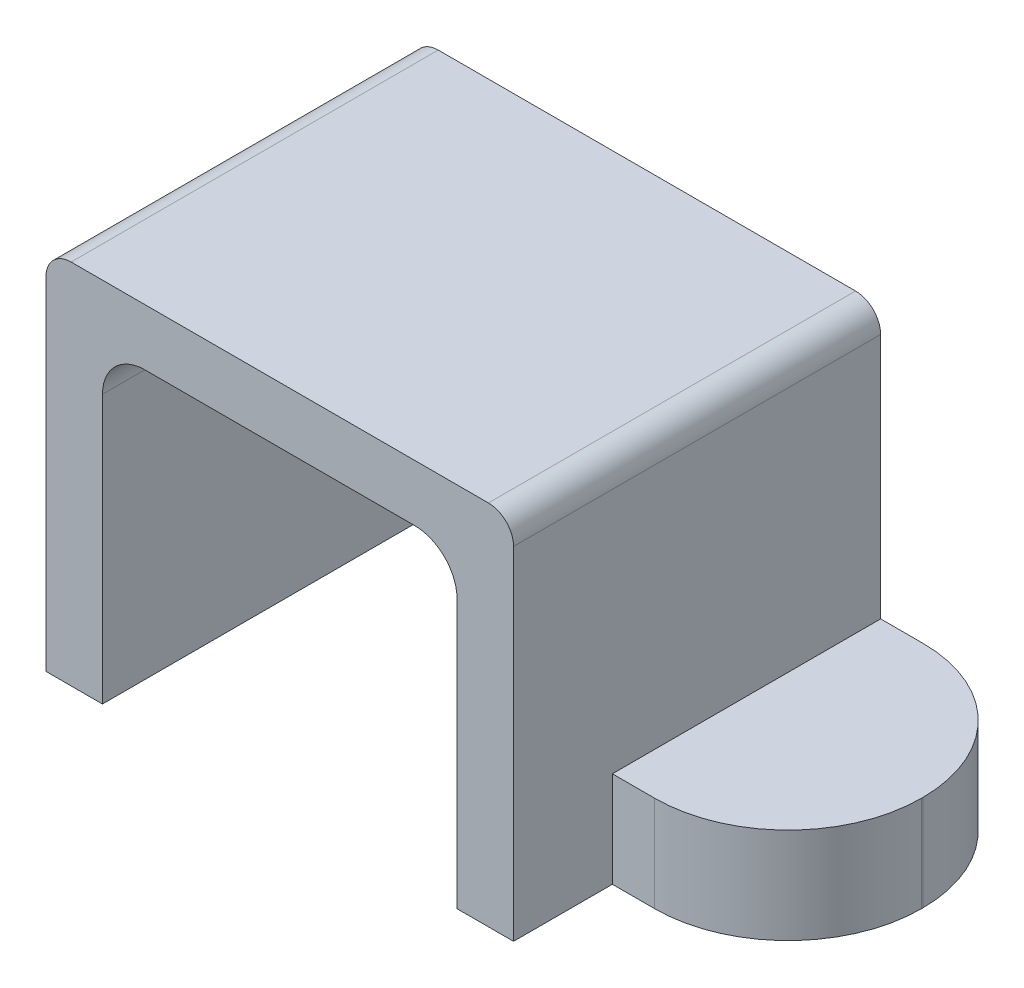
ISO-10303-21;
HEADER;
FILE_DESCRIPTION(('STEP AP214'),'2;1');
FILE_NAME('part.step','',(''),(''),'','','');
FILE_SCHEMA(('AUTOMOTIVE_DESIGN { 1 0 10303 214 1 1 1 1 }'));
ENDSEC;
DATA;
#1=APPLICATION_CONTEXT('core data for automotive mechanical design processes');
#2=APPLICATION_PROTOCOL_DEFINITION('international standard','automotive_design',2000,#1);
#3=PRODUCT_CONTEXT('',#1,'mechanical');
#4=PRODUCT('Part','Part','',(#3));
#5=PRODUCT_RELATED_PRODUCT_CATEGORY('part','',(#4));
#6=PRODUCT_DEFINITION_FORMATION('','',#4);
#7=PRODUCT_DEFINITION_CONTEXT('part definition',#1,'design');
#8=PRODUCT_DEFINITION('design','',#6,#7);
#9=PRODUCT_DEFINITION_SHAPE('','',#8);
#10=(LENGTH_UNIT() NAMED_UNIT(*) SI_UNIT(.MILLI.,.METRE.));
#11=(NAMED_UNIT(*) PLANE_ANGLE_UNIT() SI_UNIT($,.RADIAN.));
#12=(NAMED_UNIT(*) SI_UNIT($,.STERADIAN.) SOLID_ANGLE_UNIT());
#13=UNCERTAINTY_MEASURE_WITH_UNIT(LENGTH_MEASURE(1.E-05),#10,'distance_accuracy_value','');
#14=(GEOMETRIC_REPRESENTATION_CONTEXT(3) GLOBAL_UNCERTAINTY_ASSIGNED_CONTEXT((#13)) GLOBAL_UNIT_ASSIGNED_CONTEXT((#10,
#11,#12)) REPRESENTATION_CONTEXT('',''));
#15=CARTESIAN_POINT('',(0.,0.,0.));
#16=DIRECTION('',(0.,0.,1.));
#17=DIRECTION('',(1.,0.,0.));
#18=AXIS2_PLACEMENT_3D('',#15,#16,#17);
#19=CARTESIAN_POINT('',(7.45,-5.85,11.7));
#20=DIRECTION('',(-1.,0.,0.));
#21=DIRECTION('',(0.,0.,1.));
#22=AXIS2_PLACEMENT_3D('',#19,#20,#21);
#23=PLANE('',#22);
#24=DIRECTION('',(0.,0.,1.));
#25=VECTOR('',#24,1.);
#26=CARTESIAN_POINT('',(7.45,-2.8,0.));
#27=LINE('',#26,#25);
#28=CARTESIAN_POINT('',(7.45,-2.8,0.));
#29=VERTEX_POINT('',#28);
#30=CARTESIAN_POINT('',(7.45,-2.8,8.55));
#31=VERTEX_POINT('',#30);
#32=EDGE_CURVE('E202',#29,#31,#27,.T.);
#33=ORIENTED_EDGE('',*,*,#32,.F.);
#34=DIRECTION('',(0.,1.,0.));
#35=VECTOR('',#34,1.);
#36=CARTESIAN_POINT('',(7.45,-5.85,0.));
#37=LINE('',#36,#35);
#38=CARTESIAN_POINT('',(7.45,5.05,0.));
#39=VERTEX_POINT('',#38);
#40=EDGE_CURVE('E208',#29,#39,#37,.T.);
#41=ORIENTED_EDGE('',*,*,#40,.T.);
#42=DIRECTION('',(0.,0.,-1.));
#43=VECTOR('',#42,1.);
#44=CARTESIAN_POINT('',(7.45,5.05,11.7));
#45=LINE('',#44,#43);
#46=CARTESIAN_POINT('',(7.45,5.05,11.7));
#47=VERTEX_POINT('',#46);
#48=EDGE_CURVE('E340',#39,#47,#45,.F.);
#49=ORIENTED_EDGE('',*,*,#48,.T.);
#50=DIRECTION('',(0.,1.,0.));
#51=VECTOR('',#50,1.);
#52=CARTESIAN_POINT('',(7.45,-5.85,11.7));
#53=LINE('',#52,#51);
#54=CARTESIAN_POINT('',(7.45,-5.85,11.7));
#55=VERTEX_POINT('',#54);
#56=EDGE_CURVE('E300',#55,#47,#53,.T.);
#57=ORIENTED_EDGE('',*,*,#56,.F.);
#58=DIRECTION('',(0.,0.,-1.));
#59=VECTOR('',#58,1.);
#60=CARTESIAN_POINT('',(7.45,-5.85,11.7));
#61=LINE('',#60,#59);
#62=CARTESIAN_POINT('',(7.45,-5.85,8.55));
#63=VERTEX_POINT('',#62);
#64=EDGE_CURVE('E312',#55,#63,#61,.T.);
#65=ORIENTED_EDGE('',*,*,#64,.T.);
#66=DIRECTION('',(0.,1.,0.));
#67=VECTOR('',#66,1.);
#68=CARTESIAN_POINT('',(7.45,-5.85,8.55));
#69=LINE('',#68,#67);
#70=EDGE_CURVE('E220',#63,#31,#69,.T.);
#71=ORIENTED_EDGE('',*,*,#70,.T.);
#72=EDGE_LOOP('',(#33,#41,#49,#57,#65,#71));
#73=FACE_BOUND('',#72,.T.);
#74=ADVANCED_FACE('F33',(#73),#23,.F.);
#75=CARTESIAN_POINT('',(-7.45,-5.85,11.7));
#76=DIRECTION('',(1.,0.,0.));
#77=DIRECTION('',(0.,0.,-1.));
#78=AXIS2_PLACEMENT_3D('',#75,#76,#77);
#79=PLANE('',#78);
#80=DIRECTION('',(0.,1.,0.));
#81=VECTOR('',#80,1.);
#82=CARTESIAN_POINT('',(-7.45,-5.85,8.55));
#83=LINE('',#82,#81);
#84=CARTESIAN_POINT('',(-7.45,-5.85,8.55));
#85=VERTEX_POINT('',#84);
#86=CARTESIAN_POINT('',(-7.45,-2.8,8.55));
#87=VERTEX_POINT('',#86);
#88=EDGE_CURVE('E204',#85,#87,#83,.T.);
#89=ORIENTED_EDGE('',*,*,#88,.F.);
#90=DIRECTION('',(0.,0.,-1.));
#91=VECTOR('',#90,1.);
#92=CARTESIAN_POINT('',(-7.45,-5.85,11.7));
#93=LINE('',#92,#91);
#94=CARTESIAN_POINT('',(-7.45,-5.85,11.7));
#95=VERTEX_POINT('',#94);
#96=EDGE_CURVE('E322',#95,#85,#93,.T.);
#97=ORIENTED_EDGE('',*,*,#96,.F.);
#98=DIRECTION('',(0.,-1.,0.));
#99=VECTOR('',#98,1.);
#100=CARTESIAN_POINT('',(-7.45,-5.85,11.7));
#101=LINE('',#100,#99);
#102=CARTESIAN_POINT('',(-7.45,5.05,11.7));
#103=VERTEX_POINT('',#102);
#104=EDGE_CURVE('E307',#103,#95,#101,.T.);
#105=ORIENTED_EDGE('',*,*,#104,.F.);
#106=DIRECTION('',(0.,0.,-1.));
#107=VECTOR('',#106,1.);
#108=CARTESIAN_POINT('',(-7.45,5.05,11.7));
#109=LINE('',#108,#107);
#110=CARTESIAN_POINT('',(-7.45,5.05,0.));
#111=VERTEX_POINT('',#110);
#112=EDGE_CURVE('E325',#103,#111,#109,.T.);
#113=ORIENTED_EDGE('',*,*,#112,.T.);
#114=DIRECTION('',(0.,-1.,0.));
#115=VECTOR('',#114,1.);
#116=CARTESIAN_POINT('',(-7.45,-5.85,0.));
#117=LINE('',#116,#115);
#118=CARTESIAN_POINT('',(-7.45,-2.8,0.));
#119=VERTEX_POINT('',#118);
#120=EDGE_CURVE('E316',#111,#119,#117,.T.);
#121=ORIENTED_EDGE('',*,*,#120,.T.);
#122=DIRECTION('',(0.,0.,-1.));
#123=VECTOR('',#122,1.);
#124=CARTESIAN_POINT('',(-7.45,-2.8,0.));
#125=LINE('',#124,#123);
#126=EDGE_CURVE('E235',#87,#119,#125,.T.);
#127=ORIENTED_EDGE('',*,*,#126,.F.);
#128=EDGE_LOOP('',(#89,#97,#105,#113,#121,#127));
#129=FACE_BOUND('',#128,.T.);
#130=ADVANCED_FACE('F389',(#129),#79,.F.);
#131=CARTESIAN_POINT('',(-7.45,-5.85,11.7));
#132=DIRECTION('',(0.,1.,0.));
#133=DIRECTION('',(0.,0.,1.));
#134=AXIS2_PLACEMENT_3D('',#131,#132,#133);
#135=PLANE('',#134);
#136=DIRECTION('',(1.,0.,0.));
#137=VECTOR('',#136,1.);
#138=CARTESIAN_POINT('',(-7.45,-5.85,0.));
#139=LINE('',#138,#137);
#140=CARTESIAN_POINT('',(5.65,-5.85,0.));
#141=VERTEX_POINT('',#140);
#142=CARTESIAN_POINT('',(8.8,-5.85,0.));
#143=VERTEX_POINT('',#142);
#144=EDGE_CURVE('E319',#141,#143,#139,.T.);
#145=ORIENTED_EDGE('',*,*,#144,.T.);
#146=CARTESIAN_POINT('',(8.8,-5.85,4.25));
#147=DIRECTION('',(0.,1.,0.));
#148=DIRECTION('',(0.,0.,1.));
#149=AXIS2_PLACEMENT_3D('',#146,#147,#148);
#150=CIRCLE('',#149,4.25);
#151=CARTESIAN_POINT('',(13.05,-5.85,4.25));
#152=VERTEX_POINT('',#151);
#153=EDGE_CURVE('E41',#143,#152,#150,.F.);
#154=ORIENTED_EDGE('',*,*,#153,.T.);
#155=DIRECTION('',(0.,0.,1.));
#156=VECTOR('',#155,1.);
#157=CARTESIAN_POINT('',(13.05,-5.85,0.));
#158=LINE('',#157,#156);
#159=CARTESIAN_POINT('',(13.05,-5.85,4.3));
#160=VERTEX_POINT('',#159);
#161=EDGE_CURVE('E225',#152,#160,#158,.T.);
#162=ORIENTED_EDGE('',*,*,#161,.T.);
#163=CARTESIAN_POINT('',(8.8,-5.85,4.3));
#164=DIRECTION('',(0.,1.,0.));
#165=DIRECTION('',(0.,0.,1.));
#166=AXIS2_PLACEMENT_3D('',#163,#164,#165);
#167=CIRCLE('',#166,4.25);
#168=CARTESIAN_POINT('',(8.8,-5.85,8.55));
#169=VERTEX_POINT('',#168);
#170=EDGE_CURVE('E48',#160,#169,#167,.F.);
#171=ORIENTED_EDGE('',*,*,#170,.T.);
#172=DIRECTION('',(-1.,0.,0.));
#173=VECTOR('',#172,1.);
#174=CARTESIAN_POINT('',(13.05,-5.85,8.55));
#175=LINE('',#174,#173);
#176=EDGE_CURVE('E228',#169,#63,#175,.T.);
#177=ORIENTED_EDGE('',*,*,#176,.T.);
#178=ORIENTED_EDGE('',*,*,#64,.F.);
#179=DIRECTION('',(1.,0.,0.));
#180=VECTOR('',#179,1.);
#181=CARTESIAN_POINT('',(-7.45,-5.85,11.7));
#182=LINE('',#181,#180);
#183=CARTESIAN_POINT('',(5.65,-5.85,11.7));
#184=VERTEX_POINT('',#183);
#185=EDGE_CURVE('E309',#184,#55,#182,.T.);
#186=ORIENTED_EDGE('',*,*,#185,.F.);
#187=DIRECTION('',(0.,0.,1.));
#188=VECTOR('',#187,1.);
#189=CARTESIAN_POINT('',(5.65,-5.85,9.4));
#190=LINE('',#189,#188);
#191=EDGE_CURVE('E296',#141,#184,#190,.T.);
#192=ORIENTED_EDGE('',*,*,#191,.F.);
#193=EDGE_LOOP('',(#145,#154,#162,#171,#177,#178,#186,#192));
#194=FACE_BOUND('',#193,.T.);
#195=ADVANCED_FACE('F371',(#194),#135,.F.);
#196=CARTESIAN_POINT('',(-7.45,5.85,11.7));
#197=DIRECTION('',(0.,-1.,0.));
#198=DIRECTION('',(0.,0.,-1.));
#199=AXIS2_PLACEMENT_3D('',#196,#197,#198);
#200=PLANE('',#199);
#201=DIRECTION('',(-1.,0.,0.));
#202=VECTOR('',#201,1.);
#203=CARTESIAN_POINT('',(-7.45,5.85,0.));
#204=LINE('',#203,#202);
#205=CARTESIAN_POINT('',(6.65,5.85,0.));
#206=VERTEX_POINT('',#205);
#207=CARTESIAN_POINT('',(-6.65,5.85,0.));
#208=VERTEX_POINT('',#207);
#209=EDGE_CURVE('E214',#206,#208,#204,.T.);
#210=ORIENTED_EDGE('',*,*,#209,.T.);
#211=DIRECTION('',(0.,0.,-1.));
#212=VECTOR('',#211,1.);
#213=CARTESIAN_POINT('',(-6.65,5.85,11.7));
#214=LINE('',#213,#212);
#215=CARTESIAN_POINT('',(-6.65,5.85,11.7));
#216=VERTEX_POINT('',#215);
#217=EDGE_CURVE('E334',#208,#216,#214,.F.);
#218=ORIENTED_EDGE('',*,*,#217,.T.);
#219=DIRECTION('',(-1.,0.,0.));
#220=VECTOR('',#219,1.);
#221=CARTESIAN_POINT('',(-7.45,5.85,11.7));
#222=LINE('',#221,#220);
#223=CARTESIAN_POINT('',(6.65,5.85,11.7));
#224=VERTEX_POINT('',#223);
#225=EDGE_CURVE('E303',#224,#216,#222,.T.);
#226=ORIENTED_EDGE('',*,*,#225,.F.);
#227=DIRECTION('',(0.,0.,-1.));
#228=VECTOR('',#227,1.);
#229=CARTESIAN_POINT('',(6.65,5.85,11.7));
#230=LINE('',#229,#228);
#231=EDGE_CURVE('E331',#224,#206,#230,.T.);
#232=ORIENTED_EDGE('',*,*,#231,.T.);
#233=EDGE_LOOP('',(#210,#218,#226,#232));
#234=FACE_BOUND('',#233,.T.);
#235=ADVANCED_FACE('F398',(#234),#200,.F.);
#236=DIRECTION('',(1.,0.,0.));
#237=VECTOR('',#236,1.);
#238=CARTESIAN_POINT('',(-13.05,-5.85,8.55));
#239=LINE('',#238,#237);
#240=CARTESIAN_POINT('',(-8.8,-5.85,8.55));
#241=VERTEX_POINT('',#240);
#242=EDGE_CURVE('E246',#241,#85,#239,.T.);
#243=ORIENTED_EDGE('',*,*,#242,.F.);
#244=CARTESIAN_POINT('',(-8.8,-5.85,4.3));
#245=DIRECTION('',(0.,1.,0.));
#246=DIRECTION('',(0.,0.,1.));
#247=AXIS2_PLACEMENT_3D('',#244,#245,#246);
#248=CIRCLE('',#247,4.25);
#249=CARTESIAN_POINT('',(-13.05,-5.85,4.3));
#250=VERTEX_POINT('',#249);
#251=EDGE_CURVE('E356',#241,#250,#248,.F.);
#252=ORIENTED_EDGE('',*,*,#251,.T.);
#253=DIRECTION('',(0.,0.,1.));
#254=VECTOR('',#253,1.);
#255=CARTESIAN_POINT('',(-13.05,-5.85,0.));
#256=LINE('',#255,#254);
#257=CARTESIAN_POINT('',(-13.05,-5.85,4.25));
#258=VERTEX_POINT('',#257);
#259=EDGE_CURVE('E231',#258,#250,#256,.T.);
#260=ORIENTED_EDGE('',*,*,#259,.F.);
#261=CARTESIAN_POINT('',(-8.8,-5.85,4.25));
#262=DIRECTION('',(0.,1.,0.));
#263=DIRECTION('',(0.,0.,1.));
#264=AXIS2_PLACEMENT_3D('',#261,#262,#263);
#265=CIRCLE('',#264,4.25);
#266=CARTESIAN_POINT('',(-8.8,-5.85,0.));
#267=VERTEX_POINT('',#266);
#268=EDGE_CURVE('E354',#258,#267,#265,.F.);
#269=ORIENTED_EDGE('',*,*,#268,.T.);
#270=CARTESIAN_POINT('',(-5.65,-5.85,0.));
#271=VERTEX_POINT('',#270);
#272=EDGE_CURVE('E304',#267,#271,#139,.T.);
#273=ORIENTED_EDGE('',*,*,#272,.T.);
#274=DIRECTION('',(0.,0.,1.));
#275=VECTOR('',#274,1.);
#276=CARTESIAN_POINT('',(-5.65,-5.85,9.4));
#277=LINE('',#276,#275);
#278=CARTESIAN_POINT('',(-5.65,-5.85,11.7));
#279=VERTEX_POINT('',#278);
#280=EDGE_CURVE('E276',#271,#279,#277,.T.);
#281=ORIENTED_EDGE('',*,*,#280,.T.);
#282=EDGE_CURVE('E310',#95,#279,#182,.T.);
#283=ORIENTED_EDGE('',*,*,#282,.F.);
#284=ORIENTED_EDGE('',*,*,#96,.T.);
#285=EDGE_LOOP('',(#243,#252,#260,#269,#273,#281,#283,#284));
#286=FACE_BOUND('',#285,.T.);
#287=ADVANCED_FACE('F441',(#286),#135,.F.);
#288=CARTESIAN_POINT('',(0.,0.,11.7));
#289=DIRECTION('',(0.,0.,-1.));
#290=DIRECTION('',(-1.,0.,0.));
#291=AXIS2_PLACEMENT_3D('',#288,#289,#290);
#292=PLANE('',#291);
#293=ORIENTED_EDGE('',*,*,#225,.T.);
#294=CARTESIAN_POINT('',(-6.65,5.05,11.7));
#295=DIRECTION('',(0.,0.,-1.));
#296=DIRECTION('',(-1.,0.,0.));
#297=AXIS2_PLACEMENT_3D('',#294,#295,#296);
#298=CIRCLE('',#297,0.8);
#299=EDGE_CURVE('E338',#216,#103,#298,.F.);
#300=ORIENTED_EDGE('',*,*,#299,.T.);
#301=ORIENTED_EDGE('',*,*,#104,.T.);
#302=ORIENTED_EDGE('',*,*,#282,.T.);
#303=DIRECTION('',(0.,-1.,0.));
#304=VECTOR('',#303,1.);
#305=CARTESIAN_POINT('',(-5.65,-5.85,11.7));
#306=LINE('',#305,#304);
#307=CARTESIAN_POINT('',(-5.65,2.7,11.7));
#308=VERTEX_POINT('',#307);
#309=EDGE_CURVE('E269',#308,#279,#306,.T.);
#310=ORIENTED_EDGE('',*,*,#309,.F.);
#311=CARTESIAN_POINT('',(-4.3,2.7,11.7));
#312=DIRECTION('',(0.,0.,1.));
#313=DIRECTION('',(-1.,0.,0.));
#314=AXIS2_PLACEMENT_3D('',#311,#312,#313);
#315=CIRCLE('',#314,1.35);
#316=CARTESIAN_POINT('',(-4.3,4.05,11.7));
#317=VERTEX_POINT('',#316);
#318=EDGE_CURVE('E273',#317,#308,#315,.T.);
#319=ORIENTED_EDGE('',*,*,#318,.F.);
#320=DIRECTION('',(-1.,0.,0.));
#321=VECTOR('',#320,1.);
#322=CARTESIAN_POINT('',(-4.3,4.05,11.7));
#323=LINE('',#322,#321);
#324=CARTESIAN_POINT('',(4.3,4.05,11.7));
#325=VERTEX_POINT('',#324);
#326=EDGE_CURVE('E284',#325,#317,#323,.T.);
#327=ORIENTED_EDGE('',*,*,#326,.F.);
#328=CARTESIAN_POINT('',(4.3,2.7,11.7));
#329=DIRECTION('',(0.,0.,1.));
#330=DIRECTION('',(-1.,0.,0.));
#331=AXIS2_PLACEMENT_3D('',#328,#329,#330);
#332=CIRCLE('',#331,1.35);
#333=CARTESIAN_POINT('',(5.65,2.7,11.7));
#334=VERTEX_POINT('',#333);
#335=EDGE_CURVE('E281',#334,#325,#332,.T.);
#336=ORIENTED_EDGE('',*,*,#335,.F.);
#337=DIRECTION('',(0.,1.,0.));
#338=VECTOR('',#337,1.);
#339=CARTESIAN_POINT('',(5.65,-5.85,11.7));
#340=LINE('',#339,#338);
#341=EDGE_CURVE('E278',#184,#334,#340,.T.);
#342=ORIENTED_EDGE('',*,*,#341,.F.);
#343=ORIENTED_EDGE('',*,*,#185,.T.);
#344=ORIENTED_EDGE('',*,*,#56,.T.);
#345=CARTESIAN_POINT('',(6.65,5.05,11.7));
#346=DIRECTION('',(0.,0.,-1.));
#347=DIRECTION('',(-1.,0.,0.));
#348=AXIS2_PLACEMENT_3D('',#345,#346,#347);
#349=CIRCLE('',#348,0.8);
#350=EDGE_CURVE('E336',#47,#224,#349,.F.);
#351=ORIENTED_EDGE('',*,*,#350,.T.);
#352=EDGE_LOOP('',(#293,#300,#301,#302,#310,#319,#327,#336,#342,#343,#344,#351));
#353=FACE_BOUND('',#352,.T.);
#354=ADVANCED_FACE('F445',(#353),#292,.F.);
#355=CARTESIAN_POINT('',(0.,0.,0.));
#356=DIRECTION('',(0.,0.,-1.));
#357=DIRECTION('',(-1.,0.,0.));
#358=AXIS2_PLACEMENT_3D('',#355,#356,#357);
#359=PLANE('',#358);
#360=DIRECTION('',(-1.,0.,0.));
#361=VECTOR('',#360,1.);
#362=CARTESIAN_POINT('',(13.05,-2.8,0.));
#363=LINE('',#362,#361);
#364=CARTESIAN_POINT('',(8.8,-2.8,0.));
#365=VERTEX_POINT('',#364);
#366=EDGE_CURVE('E196',#365,#29,#363,.T.);
#367=ORIENTED_EDGE('',*,*,#366,.F.);
#368=DIRECTION('',(0.,1.,0.));
#369=VECTOR('',#368,1.);
#370=CARTESIAN_POINT('',(8.8,0.,0.));
#371=LINE('',#370,#369);
#372=EDGE_CURVE('E56',#365,#143,#371,.F.);
#373=ORIENTED_EDGE('',*,*,#372,.T.);
#374=ORIENTED_EDGE('',*,*,#144,.F.);
#375=DIRECTION('',(0.,-1.,0.));
#376=VECTOR('',#375,1.);
#377=CARTESIAN_POINT('',(5.65,0.,0.));
#378=LINE('',#377,#376);
#379=CARTESIAN_POINT('',(5.65,4.05,0.));
#380=VERTEX_POINT('',#379);
#381=EDGE_CURVE('E264',#380,#141,#378,.T.);
#382=ORIENTED_EDGE('',*,*,#381,.F.);
#383=DIRECTION('',(1.,0.,0.));
#384=VECTOR('',#383,1.);
#385=CARTESIAN_POINT('',(0.,4.05,0.));
#386=LINE('',#385,#384);
#387=CARTESIAN_POINT('',(-5.65,4.05,0.));
#388=VERTEX_POINT('',#387);
#389=EDGE_CURVE('E267',#388,#380,#386,.T.);
#390=ORIENTED_EDGE('',*,*,#389,.F.);
#391=DIRECTION('',(0.,1.,0.));
#392=VECTOR('',#391,1.);
#393=CARTESIAN_POINT('',(-5.65,0.,0.));
#394=LINE('',#393,#392);
#395=EDGE_CURVE('E260',#271,#388,#394,.T.);
#396=ORIENTED_EDGE('',*,*,#395,.F.);
#397=ORIENTED_EDGE('',*,*,#272,.F.);
#398=DIRECTION('',(0.,-1.,0.));
#399=VECTOR('',#398,1.);
#400=CARTESIAN_POINT('',(-8.8,-2.8,0.));
#401=LINE('',#400,#399);
#402=CARTESIAN_POINT('',(-8.8,-2.8,0.));
#403=VERTEX_POINT('',#402);
#404=EDGE_CURVE('E358',#267,#403,#401,.F.);
#405=ORIENTED_EDGE('',*,*,#404,.T.);
#406=DIRECTION('',(1.,0.,0.));
#407=VECTOR('',#406,1.);
#408=CARTESIAN_POINT('',(-13.05,-2.8,0.));
#409=LINE('',#408,#407);
#410=EDGE_CURVE('E238',#403,#119,#409,.T.);
#411=ORIENTED_EDGE('',*,*,#410,.T.);
#412=ORIENTED_EDGE('',*,*,#120,.F.);
#413=CARTESIAN_POINT('',(-6.65,5.05,0.));
#414=DIRECTION('',(0.,0.,-1.));
#415=DIRECTION('',(-1.,0.,0.));
#416=AXIS2_PLACEMENT_3D('',#413,#414,#415);
#417=CIRCLE('',#416,0.8);
#418=EDGE_CURVE('E329',#111,#208,#417,.T.);
#419=ORIENTED_EDGE('',*,*,#418,.T.);
#420=ORIENTED_EDGE('',*,*,#209,.F.);
#421=CARTESIAN_POINT('',(6.65,5.05,0.));
#422=DIRECTION('',(0.,0.,-1.));
#423=DIRECTION('',(-1.,0.,0.));
#424=AXIS2_PLACEMENT_3D('',#421,#422,#423);
#425=CIRCLE('',#424,0.8);
#426=EDGE_CURVE('E211',#206,#39,#425,.T.);
#427=ORIENTED_EDGE('',*,*,#426,.T.);
#428=ORIENTED_EDGE('',*,*,#40,.F.);
#429=EDGE_LOOP('',(#367,#373,#374,#382,#390,#396,#397,#405,#411,#412,#419,#420,#427,#428));
#430=FACE_BOUND('',#429,.T.);
#431=ADVANCED_FACE('F209',(#430),#359,.T.);
#432=CARTESIAN_POINT('',(-5.65,-5.85,9.4));
#433=DIRECTION('',(-1.,0.,0.));
#434=DIRECTION('',(0.,0.,1.));
#435=AXIS2_PLACEMENT_3D('',#432,#433,#434);
#436=PLANE('',#435);
#437=ORIENTED_EDGE('',*,*,#309,.T.);
#438=ORIENTED_EDGE('',*,*,#280,.F.);
#439=ORIENTED_EDGE('',*,*,#395,.T.);
#440=DIRECTION('',(0.,0.,1.));
#441=VECTOR('',#440,1.);
#442=CARTESIAN_POINT('',(-5.65,4.05,-10.6));
#443=LINE('',#442,#441);
#444=CARTESIAN_POINT('',(-5.65,4.05,9.4));
#445=VERTEX_POINT('',#444);
#446=EDGE_CURVE('E257',#388,#445,#443,.T.);
#447=ORIENTED_EDGE('',*,*,#446,.T.);
#448=DIRECTION('',(0.,-1.,0.));
#449=VECTOR('',#448,1.);
#450=CARTESIAN_POINT('',(-5.65,-5.85,9.4));
#451=LINE('',#450,#449);
#452=CARTESIAN_POINT('',(-5.65,2.7,9.4));
#453=VERTEX_POINT('',#452);
#454=EDGE_CURVE('E248',#445,#453,#451,.T.);
#455=ORIENTED_EDGE('',*,*,#454,.T.);
#456=DIRECTION('',(0.,0.,1.));
#457=VECTOR('',#456,1.);
#458=CARTESIAN_POINT('',(-5.65,2.7,9.4));
#459=LINE('',#458,#457);
#460=EDGE_CURVE('E215',#453,#308,#459,.T.);
#461=ORIENTED_EDGE('',*,*,#460,.T.);
#462=EDGE_LOOP('',(#437,#438,#439,#447,#455,#461));
#463=FACE_BOUND('',#462,.T.);
#464=ADVANCED_FACE('F482',(#463),#436,.F.);
#465=CARTESIAN_POINT('',(-4.3,2.7,9.4));
#466=DIRECTION('',(0.,0.,1.));
#467=DIRECTION('',(1.,0.,0.));
#468=AXIS2_PLACEMENT_3D('',#465,#466,#467);
#469=CYLINDRICAL_SURFACE('',#468,1.35);
#470=ORIENTED_EDGE('',*,*,#318,.T.);
#471=ORIENTED_EDGE('',*,*,#460,.F.);
#472=CARTESIAN_POINT('',(-4.3,2.7,9.4));
#473=DIRECTION('',(0.,0.,1.));
#474=DIRECTION('',(-1.,0.,0.));
#475=AXIS2_PLACEMENT_3D('',#472,#473,#474);
#476=CIRCLE('',#475,1.35);
#477=CARTESIAN_POINT('',(-4.3,4.05,9.4));
#478=VERTEX_POINT('',#477);
#479=EDGE_CURVE('E272',#478,#453,#476,.T.);
#480=ORIENTED_EDGE('',*,*,#479,.F.);
#481=DIRECTION('',(0.,0.,1.));
#482=VECTOR('',#481,1.);
#483=CARTESIAN_POINT('',(-4.3,4.05,9.4));
#484=LINE('',#483,#482);
#485=EDGE_CURVE('E290',#478,#317,#484,.T.);
#486=ORIENTED_EDGE('',*,*,#485,.T.);
#487=EDGE_LOOP('',(#470,#471,#480,#486));
#488=FACE_BOUND('',#487,.T.);
#489=ADVANCED_FACE('F478',(#488),#469,.F.);
#490=CARTESIAN_POINT('',(-4.3,4.05,9.4));
#491=DIRECTION('',(0.,1.,0.));
#492=DIRECTION('',(0.,0.,1.));
#493=AXIS2_PLACEMENT_3D('',#490,#491,#492);
#494=PLANE('',#493);
#495=ORIENTED_EDGE('',*,*,#326,.T.);
#496=ORIENTED_EDGE('',*,*,#485,.F.);
#497=DIRECTION('',(-1.,0.,0.));
#498=VECTOR('',#497,1.);
#499=CARTESIAN_POINT('',(-4.30000000000001,4.05,9.4));
#500=LINE('',#499,#498);
#501=EDGE_CURVE('E253',#478,#445,#500,.T.);
#502=ORIENTED_EDGE('',*,*,#501,.T.);
#503=ORIENTED_EDGE('',*,*,#446,.F.);
#504=ORIENTED_EDGE('',*,*,#389,.T.);
#505=DIRECTION('',(0.,0.,1.));
#506=VECTOR('',#505,1.);
#507=CARTESIAN_POINT('',(5.65,4.05,-10.6));
#508=LINE('',#507,#506);
#509=CARTESIAN_POINT('',(5.65,4.05,9.4));
#510=VERTEX_POINT('',#509);
#511=EDGE_CURVE('E258',#380,#510,#508,.T.);
#512=ORIENTED_EDGE('',*,*,#511,.T.);
#513=CARTESIAN_POINT('',(4.3,4.05,9.4));
#514=VERTEX_POINT('',#513);
#515=EDGE_CURVE('E254',#510,#514,#500,.T.);
#516=ORIENTED_EDGE('',*,*,#515,.T.);
#517=DIRECTION('',(0.,0.,1.));
#518=VECTOR('',#517,1.);
#519=CARTESIAN_POINT('',(4.3,4.05,9.4));
#520=LINE('',#519,#518);
#521=EDGE_CURVE('E292',#514,#325,#520,.T.);
#522=ORIENTED_EDGE('',*,*,#521,.T.);
#523=EDGE_LOOP('',(#495,#496,#502,#503,#504,#512,#516,#522));
#524=FACE_BOUND('',#523,.T.);
#525=ADVANCED_FACE('F481',(#524),#494,.F.);
#526=CARTESIAN_POINT('',(4.3,2.7,9.4));
#527=DIRECTION('',(0.,0.,1.));
#528=DIRECTION('',(1.,0.,0.));
#529=AXIS2_PLACEMENT_3D('',#526,#527,#528);
#530=CYLINDRICAL_SURFACE('',#529,1.35);
#531=ORIENTED_EDGE('',*,*,#335,.T.);
#532=ORIENTED_EDGE('',*,*,#521,.F.);
#533=CARTESIAN_POINT('',(4.3,2.7,9.4));
#534=DIRECTION('',(0.,0.,1.));
#535=DIRECTION('',(-1.,0.,0.));
#536=AXIS2_PLACEMENT_3D('',#533,#534,#535);
#537=CIRCLE('',#536,1.35);
#538=CARTESIAN_POINT('',(5.65,2.7,9.4));
#539=VERTEX_POINT('',#538);
#540=EDGE_CURVE('E270',#539,#514,#537,.T.);
#541=ORIENTED_EDGE('',*,*,#540,.F.);
#542=DIRECTION('',(0.,0.,1.));
#543=VECTOR('',#542,1.);
#544=CARTESIAN_POINT('',(5.65,2.7,9.4));
#545=LINE('',#544,#543);
#546=EDGE_CURVE('E294',#539,#334,#545,.T.);
#547=ORIENTED_EDGE('',*,*,#546,.T.);
#548=EDGE_LOOP('',(#531,#532,#541,#547));
#549=FACE_BOUND('',#548,.T.);
#550=ADVANCED_FACE('F486',(#549),#530,.F.);
#551=CARTESIAN_POINT('',(5.65,-5.85,9.4));
#552=DIRECTION('',(1.,0.,0.));
#553=DIRECTION('',(0.,0.,-1.));
#554=AXIS2_PLACEMENT_3D('',#551,#552,#553);
#555=PLANE('',#554);
#556=ORIENTED_EDGE('',*,*,#341,.T.);
#557=ORIENTED_EDGE('',*,*,#546,.F.);
#558=DIRECTION('',(0.,1.,0.));
#559=VECTOR('',#558,1.);
#560=CARTESIAN_POINT('',(5.65,-5.85,9.4));
#561=LINE('',#560,#559);
#562=EDGE_CURVE('E250',#539,#510,#561,.T.);
#563=ORIENTED_EDGE('',*,*,#562,.T.);
#564=ORIENTED_EDGE('',*,*,#511,.F.);
#565=ORIENTED_EDGE('',*,*,#381,.T.);
#566=ORIENTED_EDGE('',*,*,#191,.T.);
#567=EDGE_LOOP('',(#556,#557,#563,#564,#565,#566));
#568=FACE_BOUND('',#567,.T.);
#569=ADVANCED_FACE('F476',(#568),#555,.F.);
#570=CARTESIAN_POINT('',(0.,0.,9.4));
#571=DIRECTION('',(0.,0.,1.));
#572=DIRECTION('',(1.,0.,0.));
#573=AXIS2_PLACEMENT_3D('',#570,#571,#572);
#574=PLANE('',#573);
#575=ORIENTED_EDGE('',*,*,#454,.F.);
#576=ORIENTED_EDGE('',*,*,#501,.F.);
#577=ORIENTED_EDGE('',*,*,#479,.T.);
#578=EDGE_LOOP('',(#575,#576,#577));
#579=FACE_BOUND('',#578,.T.);
#580=ADVANCED_FACE('F473',(#579),#574,.F.);
#581=ORIENTED_EDGE('',*,*,#515,.F.);
#582=ORIENTED_EDGE('',*,*,#562,.F.);
#583=ORIENTED_EDGE('',*,*,#540,.T.);
#584=EDGE_LOOP('',(#581,#582,#583));
#585=FACE_BOUND('',#584,.T.);
#586=ADVANCED_FACE('F403',(#585),#574,.F.);
#587=CARTESIAN_POINT('',(-6.65,5.05,11.7));
#588=DIRECTION('',(0.,0.,-1.));
#589=DIRECTION('',(-1.,0.,0.));
#590=AXIS2_PLACEMENT_3D('',#587,#588,#589);
#591=CYLINDRICAL_SURFACE('',#590,0.8);
#592=ORIENTED_EDGE('',*,*,#299,.F.);
#593=ORIENTED_EDGE('',*,*,#217,.F.);
#594=ORIENTED_EDGE('',*,*,#418,.F.);
#595=ORIENTED_EDGE('',*,*,#112,.F.);
#596=EDGE_LOOP('',(#592,#593,#594,#595));
#597=FACE_BOUND('',#596,.T.);
#598=ADVANCED_FACE('F399',(#597),#591,.T.);
#599=CARTESIAN_POINT('',(6.65,5.05,11.7));
#600=DIRECTION('',(0.,0.,-1.));
#601=DIRECTION('',(-1.,0.,0.));
#602=AXIS2_PLACEMENT_3D('',#599,#600,#601);
#603=CYLINDRICAL_SURFACE('',#602,0.8);
#604=ORIENTED_EDGE('',*,*,#350,.F.);
#605=ORIENTED_EDGE('',*,*,#48,.F.);
#606=ORIENTED_EDGE('',*,*,#426,.F.);
#607=ORIENTED_EDGE('',*,*,#231,.F.);
#608=EDGE_LOOP('',(#604,#605,#606,#607));
#609=FACE_BOUND('',#608,.T.);
#610=ADVANCED_FACE('F402',(#609),#603,.T.);
#611=CARTESIAN_POINT('',(-13.05,-5.85,8.55));
#612=DIRECTION('',(0.,0.,-1.));
#613=DIRECTION('',(-1.,0.,0.));
#614=AXIS2_PLACEMENT_3D('',#611,#612,#613);
#615=PLANE('',#614);
#616=DIRECTION('',(1.,0.,0.));
#617=VECTOR('',#616,1.);
#618=CARTESIAN_POINT('',(-13.05,-2.8,8.55));
#619=LINE('',#618,#617);
#620=CARTESIAN_POINT('',(-8.8,-2.8,8.55));
#621=VERTEX_POINT('',#620);
#622=EDGE_CURVE('E244',#621,#87,#619,.T.);
#623=ORIENTED_EDGE('',*,*,#622,.F.);
#624=DIRECTION('',(0.,1.,0.));
#625=VECTOR('',#624,1.);
#626=CARTESIAN_POINT('',(-8.8,-5.85,8.55));
#627=LINE('',#626,#625);
#628=EDGE_CURVE('E352',#621,#241,#627,.F.);
#629=ORIENTED_EDGE('',*,*,#628,.T.);
#630=ORIENTED_EDGE('',*,*,#242,.T.);
#631=ORIENTED_EDGE('',*,*,#88,.T.);
#632=EDGE_LOOP('',(#623,#629,#630,#631));
#633=FACE_BOUND('',#632,.T.);
#634=ADVANCED_FACE('F407',(#633),#615,.F.);
#635=CARTESIAN_POINT('',(-13.05,-2.8,0.));
#636=DIRECTION('',(0.,-1.,0.));
#637=DIRECTION('',(0.,0.,-1.));
#638=AXIS2_PLACEMENT_3D('',#635,#636,#637);
#639=PLANE('',#638);
#640=DIRECTION('',(0.,0.,-1.));
#641=VECTOR('',#640,1.);
#642=CARTESIAN_POINT('',(-13.05,-2.8,0.));
#643=LINE('',#642,#641);
#644=CARTESIAN_POINT('',(-13.05,-2.8,4.3));
#645=VERTEX_POINT('',#644);
#646=CARTESIAN_POINT('',(-13.05,-2.8,4.25));
#647=VERTEX_POINT('',#646);
#648=EDGE_CURVE('E234',#645,#647,#643,.T.);
#649=ORIENTED_EDGE('',*,*,#648,.F.);
#650=CARTESIAN_POINT('',(-8.8,-2.8,4.3));
#651=DIRECTION('',(0.,-1.,0.));
#652=DIRECTION('',(0.,0.,-1.));
#653=AXIS2_PLACEMENT_3D('',#650,#651,#652);
#654=CIRCLE('',#653,4.25);
#655=EDGE_CURVE('E350',#645,#621,#654,.F.);
#656=ORIENTED_EDGE('',*,*,#655,.T.);
#657=ORIENTED_EDGE('',*,*,#622,.T.);
#658=ORIENTED_EDGE('',*,*,#126,.T.);
#659=ORIENTED_EDGE('',*,*,#410,.F.);
#660=CARTESIAN_POINT('',(-8.8,-2.8,4.25));
#661=DIRECTION('',(0.,-1.,0.));
#662=DIRECTION('',(0.,0.,-1.));
#663=AXIS2_PLACEMENT_3D('',#660,#661,#662);
#664=CIRCLE('',#663,4.25);
#665=EDGE_CURVE('E348',#403,#647,#664,.F.);
#666=ORIENTED_EDGE('',*,*,#665,.T.);
#667=EDGE_LOOP('',(#649,#656,#657,#658,#659,#666));
#668=FACE_BOUND('',#667,.T.);
#669=ADVANCED_FACE('F426',(#668),#639,.F.);
#670=CARTESIAN_POINT('',(-13.05,0.,0.));
#671=DIRECTION('',(1.,0.,0.));
#672=DIRECTION('',(0.,0.,-1.));
#673=AXIS2_PLACEMENT_3D('',#670,#671,#672);
#674=PLANE('',#673);
#675=ORIENTED_EDGE('',*,*,#259,.T.);
#676=DIRECTION('',(0.,1.,0.));
#677=VECTOR('',#676,1.);
#678=CARTESIAN_POINT('',(-13.05,0.,4.3));
#679=LINE('',#678,#677);
#680=EDGE_CURVE('E345',#250,#645,#679,.T.);
#681=ORIENTED_EDGE('',*,*,#680,.T.);
#682=ORIENTED_EDGE('',*,*,#648,.T.);
#683=DIRECTION('',(0.,-1.,0.));
#684=VECTOR('',#683,1.);
#685=CARTESIAN_POINT('',(-13.05,-5.85,4.25));
#686=LINE('',#685,#684);
#687=EDGE_CURVE('E342',#647,#258,#686,.T.);
#688=ORIENTED_EDGE('',*,*,#687,.T.);
#689=EDGE_LOOP('',(#675,#681,#682,#688));
#690=FACE_BOUND('',#689,.T.);
#691=ADVANCED_FACE('F412',(#690),#674,.F.);
#692=CARTESIAN_POINT('',(-8.8,0.,4.3));
#693=DIRECTION('',(0.,1.,0.));
#694=DIRECTION('',(0.,0.,1.));
#695=AXIS2_PLACEMENT_3D('',#692,#693,#694);
#696=CYLINDRICAL_SURFACE('',#695,4.25);
#697=ORIENTED_EDGE('',*,*,#251,.F.);
#698=ORIENTED_EDGE('',*,*,#628,.F.);
#699=ORIENTED_EDGE('',*,*,#655,.F.);
#700=ORIENTED_EDGE('',*,*,#680,.F.);
#701=EDGE_LOOP('',(#697,#698,#699,#700));
#702=FACE_BOUND('',#701,.T.);
#703=ADVANCED_FACE('F409',(#702),#696,.T.);
#704=CARTESIAN_POINT('',(-8.8,0.,4.25));
#705=DIRECTION('',(0.,1.,0.));
#706=DIRECTION('',(0.,0.,1.));
#707=AXIS2_PLACEMENT_3D('',#704,#705,#706);
#708=CYLINDRICAL_SURFACE('',#707,4.25);
#709=ORIENTED_EDGE('',*,*,#665,.F.);
#710=ORIENTED_EDGE('',*,*,#404,.F.);
#711=ORIENTED_EDGE('',*,*,#268,.F.);
#712=ORIENTED_EDGE('',*,*,#687,.F.);
#713=EDGE_LOOP('',(#709,#710,#711,#712));
#714=FACE_BOUND('',#713,.T.);
#715=ADVANCED_FACE('F411',(#714),#708,.T.);
#716=CARTESIAN_POINT('',(13.05,-2.8,0.));
#717=DIRECTION('',(0.,-1.,0.));
#718=DIRECTION('',(0.,0.,-1.));
#719=AXIS2_PLACEMENT_3D('',#716,#717,#718);
#720=PLANE('',#719);
#721=DIRECTION('',(0.,0.,1.));
#722=VECTOR('',#721,1.);
#723=CARTESIAN_POINT('',(13.05,-2.8,0.));
#724=LINE('',#723,#722);
#725=CARTESIAN_POINT('',(13.05,-2.8,4.25));
#726=VERTEX_POINT('',#725);
#727=CARTESIAN_POINT('',(13.05,-2.8,4.3));
#728=VERTEX_POINT('',#727);
#729=EDGE_CURVE('E222',#726,#728,#724,.T.);
#730=ORIENTED_EDGE('',*,*,#729,.F.);
#731=CARTESIAN_POINT('',(8.8,-2.8,4.25));
#732=DIRECTION('',(0.,-1.,0.));
#733=DIRECTION('',(0.,0.,-1.));
#734=AXIS2_PLACEMENT_3D('',#731,#732,#733);
#735=CIRCLE('',#734,4.25);
#736=EDGE_CURVE('E203',#726,#365,#735,.F.);
#737=ORIENTED_EDGE('',*,*,#736,.T.);
#738=ORIENTED_EDGE('',*,*,#366,.T.);
#739=ORIENTED_EDGE('',*,*,#32,.T.);
#740=DIRECTION('',(-1.,0.,0.));
#741=VECTOR('',#740,1.);
#742=CARTESIAN_POINT('',(13.05,-2.8,8.55));
#743=LINE('',#742,#741);
#744=CARTESIAN_POINT('',(8.8,-2.8,8.55));
#745=VERTEX_POINT('',#744);
#746=EDGE_CURVE('E205',#745,#31,#743,.T.);
#747=ORIENTED_EDGE('',*,*,#746,.F.);
#748=CARTESIAN_POINT('',(8.8,-2.8,4.3));
#749=DIRECTION('',(0.,-1.,0.));
#750=DIRECTION('',(0.,0.,-1.));
#751=AXIS2_PLACEMENT_3D('',#748,#749,#750);
#752=CIRCLE('',#751,4.25);
#753=EDGE_CURVE('E365',#745,#728,#752,.F.);
#754=ORIENTED_EDGE('',*,*,#753,.T.);
#755=EDGE_LOOP('',(#730,#737,#738,#739,#747,#754));
#756=FACE_BOUND('',#755,.T.);
#757=ADVANCED_FACE('F199',(#756),#720,.F.);
#758=CARTESIAN_POINT('',(13.05,-5.85,8.55));
#759=DIRECTION('',(0.,0.,1.));
#760=DIRECTION('',(1.,0.,0.));
#761=AXIS2_PLACEMENT_3D('',#758,#759,#760);
#762=PLANE('',#761);
#763=ORIENTED_EDGE('',*,*,#176,.F.);
#764=DIRECTION('',(0.,1.,0.));
#765=VECTOR('',#764,1.);
#766=CARTESIAN_POINT('',(8.8,-5.85,8.55));
#767=LINE('',#766,#765);
#768=EDGE_CURVE('E11',#169,#745,#767,.T.);
#769=ORIENTED_EDGE('',*,*,#768,.T.);
#770=ORIENTED_EDGE('',*,*,#746,.T.);
#771=ORIENTED_EDGE('',*,*,#70,.F.);
#772=EDGE_LOOP('',(#763,#769,#770,#771));
#773=FACE_BOUND('',#772,.T.);
#774=ADVANCED_FACE('F385',(#773),#762,.T.);
#775=CARTESIAN_POINT('',(13.05,0.,0.));
#776=DIRECTION('',(1.,0.,0.));
#777=DIRECTION('',(0.,0.,-1.));
#778=AXIS2_PLACEMENT_3D('',#775,#776,#777);
#779=PLANE('',#778);
#780=ORIENTED_EDGE('',*,*,#161,.F.);
#781=DIRECTION('',(0.,1.,0.));
#782=VECTOR('',#781,1.);
#783=CARTESIAN_POINT('',(13.05,0.,4.25));
#784=LINE('',#783,#782);
#785=EDGE_CURVE('E362',#152,#726,#784,.T.);
#786=ORIENTED_EDGE('',*,*,#785,.T.);
#787=ORIENTED_EDGE('',*,*,#729,.T.);
#788=DIRECTION('',(0.,1.,0.));
#789=VECTOR('',#788,1.);
#790=CARTESIAN_POINT('',(13.05,0.,4.3));
#791=LINE('',#790,#789);
#792=EDGE_CURVE('E360',#728,#160,#791,.F.);
#793=ORIENTED_EDGE('',*,*,#792,.T.);
#794=EDGE_LOOP('',(#780,#786,#787,#793));
#795=FACE_BOUND('',#794,.T.);
#796=ADVANCED_FACE('F375',(#795),#779,.T.);
#797=CARTESIAN_POINT('',(8.8,0.,4.25));
#798=DIRECTION('',(0.,1.,0.));
#799=DIRECTION('',(0.,0.,1.));
#800=AXIS2_PLACEMENT_3D('',#797,#798,#799);
#801=CYLINDRICAL_SURFACE('',#800,4.25);
#802=ORIENTED_EDGE('',*,*,#153,.F.);
#803=ORIENTED_EDGE('',*,*,#372,.F.);
#804=ORIENTED_EDGE('',*,*,#736,.F.);
#805=ORIENTED_EDGE('',*,*,#785,.F.);
#806=EDGE_LOOP('',(#802,#803,#804,#805));
#807=FACE_BOUND('',#806,.T.);
#808=ADVANCED_FACE('F378',(#807),#801,.T.);
#809=CARTESIAN_POINT('',(8.8,-5.85,4.3));
#810=DIRECTION('',(0.,1.,0.));
#811=DIRECTION('',(0.,0.,1.));
#812=AXIS2_PLACEMENT_3D('',#809,#810,#811);
#813=CYLINDRICAL_SURFACE('',#812,4.25);
#814=ORIENTED_EDGE('',*,*,#170,.F.);
#815=ORIENTED_EDGE('',*,*,#792,.F.);
#816=ORIENTED_EDGE('',*,*,#753,.F.);
#817=ORIENTED_EDGE('',*,*,#768,.F.);
#818=EDGE_LOOP('',(#814,#815,#816,#817));
#819=FACE_BOUND('',#818,.T.);
#820=ADVANCED_FACE('F35',(#819),#813,.T.);
#821=CLOSED_SHELL('',(#74,#130,#195,#235,#287,#354,#431,#464,#489,#525,#550,#569,#580,#586,#598,
#610,#634,#669,#691,#703,#715,#757,#774,#796,#808,#820));
#822=MANIFOLD_SOLID_BREP('B2',#821);
#823=ADVANCED_BREP_SHAPE_REPRESENTATION('',(#18,#822),#14);
#824=SHAPE_DEFINITION_REPRESENTATION(#9,#823);
ENDSEC;
END-ISO-10303-21;
